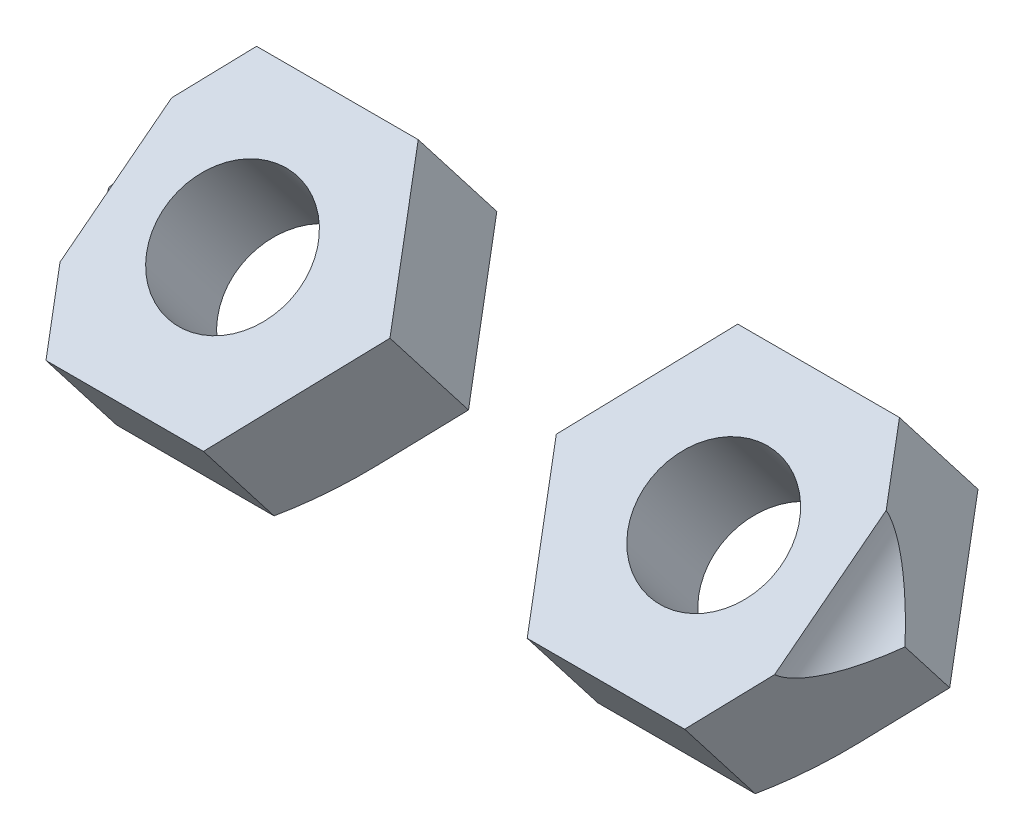
ISO-10303-21;
HEADER;
FILE_DESCRIPTION(('STEP AP214'),'2;1');
FILE_NAME('part.step','',(''),(''),'','','');
FILE_SCHEMA(('AUTOMOTIVE_DESIGN { 1 0 10303 214 1 1 1 1 }'));
ENDSEC;
DATA;
#1=APPLICATION_CONTEXT('core data for automotive mechanical design processes');
#2=APPLICATION_PROTOCOL_DEFINITION('international standard','automotive_design',2000,#1);
#3=PRODUCT_CONTEXT('',#1,'mechanical');
#4=PRODUCT('Part','Part','',(#3));
#5=PRODUCT_RELATED_PRODUCT_CATEGORY('part','',(#4));
#6=PRODUCT_DEFINITION_FORMATION('','',#4);
#7=PRODUCT_DEFINITION_CONTEXT('part definition',#1,'design');
#8=PRODUCT_DEFINITION('design','',#6,#7);
#9=PRODUCT_DEFINITION_SHAPE('','',#8);
#10=(LENGTH_UNIT() NAMED_UNIT(*) SI_UNIT(.MILLI.,.METRE.));
#11=(NAMED_UNIT(*) PLANE_ANGLE_UNIT() SI_UNIT($,.RADIAN.));
#12=(NAMED_UNIT(*) SI_UNIT($,.STERADIAN.) SOLID_ANGLE_UNIT());
#13=UNCERTAINTY_MEASURE_WITH_UNIT(LENGTH_MEASURE(1.E-05),#10,'distance_accuracy_value','');
#14=(GEOMETRIC_REPRESENTATION_CONTEXT(3) GLOBAL_UNCERTAINTY_ASSIGNED_CONTEXT((#13)) GLOBAL_UNIT_ASSIGNED_CONTEXT((#10,
#11,#12)) REPRESENTATION_CONTEXT('',''));
#15=CARTESIAN_POINT('',(0.,0.,0.));
#16=DIRECTION('',(0.,0.,1.));
#17=DIRECTION('',(1.,0.,0.));
#18=AXIS2_PLACEMENT_3D('',#15,#16,#17);
#19=CARTESIAN_POINT('',(35.,10.1270030942691,-11.4457987195592));
#20=DIRECTION('',(0.,-0.612217280034445,0.790689573743847));
#21=DIRECTION('',(0.,-0.790689573743847,-0.612217280034445));
#22=AXIS2_PLACEMENT_3D('',#19,#20,#21);
#23=PLANE('',#22);
#24=DIRECTION('',(0.,0.790689573743847,0.612217280034445));
#25=VECTOR('',#24,1.);
#26=CARTESIAN_POINT('',(9.96017032896648,10.1270030942691,-11.4457987195592));
#27=LINE('',#26,#25);
#28=CARTESIAN_POINT('',(9.96017032896648,10.1270030942691,-11.4457987195592));
#29=VERTEX_POINT('',#28);
#30=CARTESIAN_POINT('',(9.96017032896648,16.4525196842199,-6.54806047928366));
#31=VERTEX_POINT('',#30);
#32=EDGE_CURVE('E185',#29,#31,#27,.T.);
#33=ORIENTED_EDGE('',*,*,#32,.T.);
#34=DIRECTION('',(1.,0.,0.));
#35=VECTOR('',#34,1.);
#36=CARTESIAN_POINT('',(35.,16.4525196842199,-6.54806047928366));
#37=LINE('',#36,#35);
#38=CARTESIAN_POINT('',(20.0398296710335,16.4525196842199,-6.54806047928366));
#39=VERTEX_POINT('',#38);
#40=EDGE_CURVE('E57',#31,#39,#37,.T.);
#41=ORIENTED_EDGE('',*,*,#40,.T.);
#42=DIRECTION('',(0.,-0.790689573743847,-0.612217280034445));
#43=VECTOR('',#42,1.);
#44=CARTESIAN_POINT('',(20.0398296710335,10.1270030942691,-11.4457987195592));
#45=LINE('',#44,#43);
#46=CARTESIAN_POINT('',(20.0398296710335,10.1270030942691,-11.4457987195592));
#47=VERTEX_POINT('',#46);
#48=EDGE_CURVE('E180',#39,#47,#45,.T.);
#49=ORIENTED_EDGE('',*,*,#48,.T.);
#50=DIRECTION('',(-1.,0.,0.));
#51=VECTOR('',#50,1.);
#52=CARTESIAN_POINT('',(35.,10.1270030942691,-11.4457987195592));
#53=LINE('',#52,#51);
#54=EDGE_CURVE('E151',#47,#29,#53,.T.);
#55=ORIENTED_EDGE('',*,*,#54,.T.);
#56=EDGE_LOOP('',(#33,#41,#49,#55));
#57=FACE_BOUND('',#56,.T.);
#58=ADVANCED_FACE('F53',(#57),#23,.F.);
#59=CARTESIAN_POINT('',(35.,0.,1.63340701514295));
#60=DIRECTION('',(0.,0.790689573743847,0.612217280034445));
#61=DIRECTION('',(0.,-0.612217280034445,0.790689573743847));
#62=AXIS2_PLACEMENT_3D('',#59,#60,#61);
#63=PLANE('',#62);
#64=DIRECTION('',(0.5,-0.530195717145641,0.684757257369661));
#65=VECTOR('',#64,1.);
#66=CARTESIAN_POINT('',(5.18504542377636,5.06350154713457,-4.90619585220813));
#67=LINE('',#66,#65);
#68=CARTESIAN_POINT('',(5.18504542377636,5.06350154713457,-4.90619585220813));
#69=VERTEX_POINT('',#68);
#70=CARTESIAN_POINT('',(7.59149303315961,2.51172511507384,-1.61053092219803));
#71=VERTEX_POINT('',#70);
#72=EDGE_CURVE('E156',#69,#71,#67,.T.);
#73=ORIENTED_EDGE('',*,*,#72,.F.);
#74=DIRECTION('',(-0.5,-0.530195717145641,0.68475725736966));
#75=VECTOR('',#74,1.);
#76=CARTESIAN_POINT('',(10.0925227118882,10.2673484274273,-11.6270572290308));
#77=LINE('',#76,#75);
#78=EDGE_CURVE('E13',#29,#69,#77,.T.);
#79=ORIENTED_EDGE('',*,*,#78,.F.);
#80=ORIENTED_EDGE('',*,*,#54,.F.);
#81=DIRECTION('',(-0.5,0.530195717145641,-0.684757257369661));
#82=VECTOR('',#81,1.);
#83=CARTESIAN_POINT('',(24.8149545762236,5.06350154713456,-4.90619585220813));
#84=LINE('',#83,#82);
#85=CARTESIAN_POINT('',(24.8149545762236,5.06350154713456,-4.90619585220813));
#86=VERTEX_POINT('',#85);
#87=EDGE_CURVE('E131',#86,#47,#84,.T.);
#88=ORIENTED_EDGE('',*,*,#87,.F.);
#89=DIRECTION('',(0.500000000000001,0.530195717145641,-0.68475725736966));
#90=VECTOR('',#89,1.);
#91=CARTESIAN_POINT('',(19.9074772881118,-0.140345333158215,1.81466552461457));
#92=LINE('',#91,#90);
#93=CARTESIAN_POINT('',(22.4085069668404,2.51172511507384,-1.61053092219803));
#94=VERTEX_POINT('',#93);
#95=EDGE_CURVE('E139',#94,#86,#92,.T.);
#96=ORIENTED_EDGE('',*,*,#95,.F.);
#97=DIRECTION('',(-1.,0.,0.));
#98=VECTOR('',#97,1.);
#99=CARTESIAN_POINT('',(35.,2.51172511507384,-1.61053092219803));
#100=LINE('',#99,#98);
#101=CARTESIAN_POINT('',(17.8067160009308,2.51172511507386,-1.61053092219802));
#102=VERTEX_POINT('',#101);
#103=EDGE_CURVE('E179',#94,#102,#100,.T.);
#104=ORIENTED_EDGE('',*,*,#103,.T.);
#105=CARTESIAN_POINT('',(15.,5.06350154713459,-4.90619585220811));
#106=DIRECTION('',(0.,-0.790689573743847,-0.612217280034445));
#107=DIRECTION('',(0.,0.612217280034445,-0.790689573743847));
#108=AXIS2_PLACEMENT_3D('',#105,#106,#107);
#109=CIRCLE('',#108,5.025);
#110=CARTESIAN_POINT('',(12.1932839990692,2.51172511507386,-1.61053092219802));
#111=VERTEX_POINT('',#110);
#112=EDGE_CURVE('E204',#111,#102,#109,.T.);
#113=ORIENTED_EDGE('',*,*,#112,.F.);
#114=DIRECTION('',(-1.,0.,0.));
#115=VECTOR('',#114,1.);
#116=CARTESIAN_POINT('',(35.,2.51172511507384,-1.61053092219803));
#117=LINE('',#116,#115);
#118=EDGE_CURVE('E164',#111,#71,#117,.T.);
#119=ORIENTED_EDGE('',*,*,#118,.T.);
#120=EDGE_LOOP('',(#73,#79,#80,#88,#96,#104,#113,#119));
#121=FACE_BOUND('',#120,.T.);
#122=ADVANCED_FACE('F148',(#121),#63,.F.);
#123=CARTESIAN_POINT('',(15.,5.06350154713459,-4.90619585220811));
#124=DIRECTION('',(0.,-0.790689573743847,-0.612217280034445));
#125=DIRECTION('',(0.,0.612217280034445,-0.790689573743847));
#126=AXIS2_PLACEMENT_3D('',#123,#124,#125);
#127=CYLINDRICAL_SURFACE('',#126,4.24999999999999);
#128=CARTESIAN_POINT('',(15.,11.3890181370853,-0.00845761193256963));
#129=DIRECTION('',(0.,-0.790689573743847,-0.612217280034445));
#130=DIRECTION('',(0.,0.612217280034445,-0.790689573743847));
#131=AXIS2_PLACEMENT_3D('',#128,#129,#130);
#132=CIRCLE('',#131,4.24999999999999);
#133=CARTESIAN_POINT('',(15.,13.9909415772317,-3.36888830034391));
#134=VERTEX_POINT('',#133);
#135=EDGE_CURVE('E160',#134,#134,#132,.F.);
#136=ORIENTED_EDGE('',*,*,#135,.T.);
#137=EDGE_LOOP('',(#136));
#138=FACE_BOUND('',#137,.T.);
#139=CARTESIAN_POINT('',(15.,5.67628596678607,-4.43172746018142));
#140=DIRECTION('',(0.,-0.790689573743847,-0.612217280034445));
#141=DIRECTION('',(0.,0.612217280034445,-0.790689573743847));
#142=AXIS2_PLACEMENT_3D('',#139,#140,#141);
#143=CIRCLE('',#142,4.25);
#144=CARTESIAN_POINT('',(15.,8.27820940693246,-7.79215814859276));
#145=VERTEX_POINT('',#144);
#146=EDGE_CURVE('E163',#145,#145,#143,.T.);
#147=ORIENTED_EDGE('',*,*,#146,.T.);
#148=EDGE_LOOP('',(#147));
#149=FACE_BOUND('',#148,.T.);
#150=ADVANCED_FACE('F216',(#138,#149),#127,.F.);
#151=CARTESIAN_POINT('',(15.,5.06350154713459,-4.90619585220811));
#152=DIRECTION('',(0.,-0.790689573743847,-0.612217280034445));
#153=DIRECTION('',(0.,0.612217280034445,-0.790689573743847));
#154=AXIS2_PLACEMENT_3D('',#151,#152,#153);
#155=CONICAL_SURFACE('',#154,5.025,0.78539816339745);
#156=ORIENTED_EDGE('',*,*,#146,.F.);
#157=EDGE_LOOP('',(#156));
#158=FACE_BOUND('',#157,.T.);
#159=ORIENTED_EDGE('',*,*,#112,.T.);
#160=CARTESIAN_POINT('',(17.8067160009308,2.51172511507386,-1.61053092219802));
#161=CARTESIAN_POINT('',(17.7030192372063,2.46898413215126,-1.55531409723204));
#162=CARTESIAN_POINT('',(17.5964133734375,2.42940138175753,-1.5032124944047));
#163=CARTESIAN_POINT('',(17.3783348533039,2.35629021075672,-1.40553697721012));
#164=CARTESIAN_POINT('',(17.2668654100693,2.32275786595345,-1.35995883582597));
#165=CARTESIAN_POINT('',(17.0402097232274,2.26152122008594,-1.27567980442458));
#166=CARTESIAN_POINT('',(16.9250354553005,2.23379996528152,-1.2369589611562));
#167=CARTESIAN_POINT('',(16.6914453460738,2.18381099442509,-1.16640759295901));
#168=CARTESIAN_POINT('',(16.5730288242458,2.16154443318634,-1.13457852725389));
#169=CARTESIAN_POINT('',(16.1962857072843,2.09969064301842,-1.04548109743418));
#170=CARTESIAN_POINT('',(15.9332333865531,2.06952077528535,-1.00089448118005));
#171=CARTESIAN_POINT('',(15.4017352533281,2.03187476962364,-0.945057594814356));
#172=CARTESIAN_POINT('',(15.1332805120876,2.02443995160698,-0.933868023185205));
#173=CARTESIAN_POINT('',(14.5695224707663,2.03236737586458,-0.945723738098697));
#174=CARTESIAN_POINT('',(14.2743189277137,2.05017115204987,-0.972435794387851));
#175=CARTESIAN_POINT('',(13.6939261152242,2.11410281997892,-1.06629483144239));
#176=CARTESIAN_POINT('',(13.4087190013475,2.16017720500566,-1.13336542250657));
#177=CARTESIAN_POINT('',(12.9681181098398,2.25839791243012,-1.27143013522629));
#178=CARTESIAN_POINT('',(12.8065446165969,2.30069456162367,-1.33005782851355));
#179=CARTESIAN_POINT('',(12.4925108388099,2.39712631324149,-1.46053380472282));
#180=CARTESIAN_POINT('',(12.3400523091089,2.45126368599522,-1.53238462261508));
#181=CARTESIAN_POINT('',(12.1932839990692,2.51172511507382,-1.61053092219801));
#182=B_SPLINE_CURVE_WITH_KNOTS('',3,(#160,#161,#162,#163,#164,#165,#166,#167,#168,#169,#170,
#171,#172,#173,#174,#175,#176,#177,#178,#179,#180,#181),.UNSPECIFIED.,.F.,.F.,(4,2,2,2,2,2,2,2,
2,2,4),(0.,0.374868988773201,0.749493962645673,1.12301027766269,1.49660560161683,
2.29860494551191,3.10206102277787,3.98875385753598,4.8737736367147,5.40377668602794,
5.93388144686573),.UNSPECIFIED.);
#183=EDGE_CURVE('E198',#102,#111,#182,.T.);
#184=ORIENTED_EDGE('',*,*,#183,.T.);
#185=EDGE_LOOP('',(#159,#184));
#186=FACE_BOUND('',#185,.T.);
#187=ADVANCED_FACE('F210',(#158,#186),#155,.F.);
#188=CARTESIAN_POINT('',(26.5,16.8135015471346,-6.2685584577647));
#189=DIRECTION('',(0.,0.612217280034445,-0.790689573743847));
#190=DIRECTION('',(0.,0.790689573743847,0.612217280034445));
#191=AXIS2_PLACEMENT_3D('',#188,#189,#190);
#192=CYLINDRICAL_SURFACE('',#191,4.24999999999999);
#193=CARTESIAN_POINT('',(26.5,9.96319226623581,2.57873857544319));
#194=DIRECTION('',(-0.866025403784439,-0.306108640017222,0.395344786871923));
#195=DIRECTION('',(-0.5,0.530195717145641,-0.684757257369661));
#196=AXIS2_PLACEMENT_3D('',#193,#194,#195);
#197=ELLIPSE('',#196,8.49999999999999,4.24999999999999);
#198=CARTESIAN_POINT('',(24.8149545762236,8.66498077414306,-2.11763269205446));
#199=VERTEX_POINT('',#198);
#200=CARTESIAN_POINT('',(22.2745922427991,14.0827965954449,-3.48752070025451));
#201=VERTEX_POINT('',#200);
#202=EDGE_CURVE('E134',#199,#201,#197,.F.);
#203=ORIENTED_EDGE('',*,*,#202,.T.);
#204=DIRECTION('',(0.,0.612217280034445,-0.790689573743847));
#205=VECTOR('',#204,1.);
#206=CARTESIAN_POINT('',(22.2745922427991,16.4525196842199,-6.54806047928366));
#207=LINE('',#206,#205);
#208=CARTESIAN_POINT('',(22.2745922427991,8.69523967872576,3.47060547638936));
#209=VERTEX_POINT('',#208);
#210=EDGE_CURVE('E166',#201,#209,#207,.F.);
#211=ORIENTED_EDGE('',*,*,#210,.T.);
#212=CARTESIAN_POINT('',(26.5,13.5368077337642,-2.0366497562704));
#213=DIRECTION('',(-0.866025403784438,0.306108640017223,-0.395344786871924));
#214=DIRECTION('',(0.500000000000001,0.530195717145641,-0.68475725736966));
#215=AXIS2_PLACEMENT_3D('',#212,#213,#214);
#216=ELLIPSE('',#215,8.49999999999998,4.24999999999999);
#217=EDGE_CURVE('E169',#209,#199,#216,.F.);
#218=ORIENTED_EDGE('',*,*,#217,.T.);
#219=EDGE_LOOP('',(#203,#211,#218));
#220=FACE_BOUND('',#219,.T.);
#221=ADVANCED_FACE('F215',(#220),#192,.F.);
#222=CARTESIAN_POINT('',(35.,12.,5.73607643821531));
#223=DIRECTION('',(-1.,0.,0.));
#224=DIRECTION('',(0.,0.,1.));
#225=AXIS2_PLACEMENT_3D('',#222,#223,#224);
#226=CYLINDRICAL_SURFACE('',#225,12.);
#227=CARTESIAN_POINT('',(7.59149303315961,12.,5.73607643821531));
#228=DIRECTION('',(0.866025403784439,0.306108640017222,-0.395344786871923));
#229=DIRECTION('',(-0.5,0.530195717145641,-0.684757257369661));
#230=AXIS2_PLACEMENT_3D('',#227,#228,#229);
#231=ELLIPSE('',#230,13.856406460551,12.);
#232=CARTESIAN_POINT('',(10.0925227118882,0.499461345763988,2.31005678526184));
#233=VERTEX_POINT('',#232);
#234=EDGE_CURVE('E157',#71,#233,#231,.F.);
#235=ORIENTED_EDGE('',*,*,#234,.F.);
#236=ORIENTED_EDGE('',*,*,#118,.F.);
#237=ORIENTED_EDGE('',*,*,#183,.F.);
#238=ORIENTED_EDGE('',*,*,#103,.F.);
#239=CARTESIAN_POINT('',(22.4085069668404,12.,5.73607643821531));
#240=DIRECTION('',(-0.866025403784438,0.306108640017223,-0.395344786871924));
#241=DIRECTION('',(-0.500000000000001,-0.530195717145641,0.68475725736966));
#242=AXIS2_PLACEMENT_3D('',#239,#240,#241);
#243=ELLIPSE('',#242,13.856406460551,12.);
#244=CARTESIAN_POINT('',(19.9074772881118,0.499461345763988,2.31005678526184));
#245=VERTEX_POINT('',#244);
#246=EDGE_CURVE('E142',#245,#94,#243,.F.);
#247=ORIENTED_EDGE('',*,*,#246,.F.);
#248=DIRECTION('',(-1.,0.,0.));
#249=VECTOR('',#248,1.);
#250=CARTESIAN_POINT('',(35.,0.499461345763988,2.31005678526185));
#251=LINE('',#250,#249);
#252=EDGE_CURVE('E176',#233,#245,#251,.F.);
#253=ORIENTED_EDGE('',*,*,#252,.F.);
#254=EDGE_LOOP('',(#235,#236,#237,#238,#247,#253));
#255=FACE_BOUND('',#254,.T.);
#256=ADVANCED_FACE('F206',(#255),#226,.T.);
#257=CARTESIAN_POINT('',(19.9074772881118,7.76655040428025,7.93683832495902));
#258=DIRECTION('',(-0.866025403784438,0.306108640017223,-0.395344786871924));
#259=DIRECTION('',(-0.415279626546991,0.,0.909693812101078));
#260=AXIS2_PLACEMENT_3D('',#257,#258,#259);
#261=PLANE('',#260);
#262=ORIENTED_EDGE('',*,*,#217,.F.);
#263=DIRECTION('',(-0.500000000000001,-0.530195717145641,0.68475725736966));
#264=VECTOR('',#263,1.);
#265=CARTESIAN_POINT('',(19.9074772881118,6.18517125679256,6.71240376489012));
#266=LINE('',#265,#264);
#267=CARTESIAN_POINT('',(19.9074772881118,6.18517125679256,6.71240376489012));
#268=VERTEX_POINT('',#267);
#269=EDGE_CURVE('E170',#209,#268,#266,.T.);
#270=ORIENTED_EDGE('',*,*,#269,.T.);
#271=DIRECTION('',(0.,-0.790689573743847,-0.612217280034445));
#272=VECTOR('',#271,1.);
#273=CARTESIAN_POINT('',(19.9074772881118,7.76655040428025,7.93683832495902));
#274=LINE('',#273,#272);
#275=EDGE_CURVE('E173',#268,#245,#274,.T.);
#276=ORIENTED_EDGE('',*,*,#275,.T.);
#277=ORIENTED_EDGE('',*,*,#246,.T.);
#278=ORIENTED_EDGE('',*,*,#95,.T.);
#279=DIRECTION('',(0.,-0.790689573743847,-0.612217280034445));
#280=VECTOR('',#279,1.);
#281=CARTESIAN_POINT('',(24.8149545762236,12.970397284573,1.21597694813632));
#282=LINE('',#281,#280);
#283=EDGE_CURVE('E126',#199,#86,#282,.T.);
#284=ORIENTED_EDGE('',*,*,#283,.F.);
#285=EDGE_LOOP('',(#262,#270,#276,#277,#278,#284));
#286=FACE_BOUND('',#285,.T.);
#287=ADVANCED_FACE('F140',(#286),#261,.F.);
#288=CARTESIAN_POINT('',(10.0925227118882,7.76655040428025,7.93683832495902));
#289=DIRECTION('',(0.,0.612217280034445,-0.790689573743847));
#290=DIRECTION('',(0.,0.790689573743847,0.612217280034445));
#291=AXIS2_PLACEMENT_3D('',#288,#289,#290);
#292=PLANE('',#291);
#293=ORIENTED_EDGE('',*,*,#275,.F.);
#294=DIRECTION('',(-1.,0.,0.));
#295=VECTOR('',#294,1.);
#296=CARTESIAN_POINT('',(10.0925227118882,6.18517125679256,6.71240376489012));
#297=LINE('',#296,#295);
#298=CARTESIAN_POINT('',(10.0925227118882,6.18517125679256,6.71240376489013));
#299=VERTEX_POINT('',#298);
#300=EDGE_CURVE('E145',#268,#299,#297,.T.);
#301=ORIENTED_EDGE('',*,*,#300,.T.);
#302=DIRECTION('',(0.,-0.790689573743847,-0.612217280034445));
#303=VECTOR('',#302,1.);
#304=CARTESIAN_POINT('',(10.0925227118882,7.76655040428025,7.93683832495902));
#305=LINE('',#304,#303);
#306=EDGE_CURVE('E175',#299,#233,#305,.T.);
#307=ORIENTED_EDGE('',*,*,#306,.T.);
#308=ORIENTED_EDGE('',*,*,#252,.T.);
#309=EDGE_LOOP('',(#293,#301,#307,#308));
#310=FACE_BOUND('',#309,.T.);
#311=ADVANCED_FACE('F228',(#310),#292,.F.);
#312=CARTESIAN_POINT('',(5.18504542377636,12.970397284573,1.21597694813632));
#313=DIRECTION('',(0.866025403784439,0.306108640017222,-0.395344786871923));
#314=DIRECTION('',(-0.41527962654699,0.,-0.909693812101079));
#315=AXIS2_PLACEMENT_3D('',#312,#313,#314);
#316=PLANE('',#315);
#317=ORIENTED_EDGE('',*,*,#306,.F.);
#318=DIRECTION('',(-0.5,0.530195717145641,-0.684757257369661));
#319=VECTOR('',#318,1.);
#320=CARTESIAN_POINT('',(5.18504542377636,11.3890181370853,-0.0084576119325692));
#321=LINE('',#320,#319);
#322=CARTESIAN_POINT('',(5.18504542377636,11.3890181370853,-0.00845761193256876));
#323=VERTEX_POINT('',#322);
#324=EDGE_CURVE('E88',#299,#323,#321,.T.);
#325=ORIENTED_EDGE('',*,*,#324,.T.);
#326=DIRECTION('',(0.,-0.790689573743847,-0.612217280034445));
#327=VECTOR('',#326,1.);
#328=CARTESIAN_POINT('',(5.18504542377636,12.970397284573,1.21597694813632));
#329=LINE('',#328,#327);
#330=EDGE_CURVE('E158',#323,#69,#329,.T.);
#331=ORIENTED_EDGE('',*,*,#330,.T.);
#332=ORIENTED_EDGE('',*,*,#72,.T.);
#333=ORIENTED_EDGE('',*,*,#234,.T.);
#334=EDGE_LOOP('',(#317,#325,#331,#332,#333));
#335=FACE_BOUND('',#334,.T.);
#336=ADVANCED_FACE('F225',(#335),#316,.F.);
#337=CARTESIAN_POINT('',(24.8149545762236,12.970397284573,1.21597694813632));
#338=DIRECTION('',(-0.866025403784439,-0.306108640017222,0.395344786871923));
#339=DIRECTION('',(0.41527962654699,0.,0.909693812101078));
#340=AXIS2_PLACEMENT_3D('',#337,#338,#339);
#341=PLANE('',#340);
#342=ORIENTED_EDGE('',*,*,#48,.F.);
#343=DIRECTION('',(0.5,-0.530195717145641,0.684757257369661));
#344=VECTOR('',#343,1.);
#345=CARTESIAN_POINT('',(24.8149545762236,11.3890181370853,-0.00845761193256638));
#346=LINE('',#345,#344);
#347=EDGE_CURVE('E72',#39,#201,#346,.T.);
#348=ORIENTED_EDGE('',*,*,#347,.T.);
#349=ORIENTED_EDGE('',*,*,#202,.F.);
#350=ORIENTED_EDGE('',*,*,#283,.T.);
#351=ORIENTED_EDGE('',*,*,#87,.T.);
#352=EDGE_LOOP('',(#342,#348,#349,#350,#351));
#353=FACE_BOUND('',#352,.T.);
#354=ADVANCED_FACE('F129',(#353),#341,.F.);
#355=CARTESIAN_POINT('',(10.0925227118882,18.1742441648658,-5.50488442868637));
#356=DIRECTION('',(0.866025403784439,-0.306108640017223,0.395344786871924));
#357=DIRECTION('',(0.415279626546991,0.,-0.909693812101078));
#358=AXIS2_PLACEMENT_3D('',#355,#356,#357);
#359=PLANE('',#358);
#360=ORIENTED_EDGE('',*,*,#330,.F.);
#361=DIRECTION('',(0.5,0.530195717145641,-0.68475725736966));
#362=VECTOR('',#361,1.);
#363=CARTESIAN_POINT('',(10.0925227118882,16.5928650173781,-6.72931898875526));
#364=LINE('',#363,#362);
#365=EDGE_CURVE('E63',#323,#31,#364,.T.);
#366=ORIENTED_EDGE('',*,*,#365,.T.);
#367=ORIENTED_EDGE('',*,*,#32,.F.);
#368=ORIENTED_EDGE('',*,*,#78,.T.);
#369=EDGE_LOOP('',(#360,#366,#367,#368));
#370=FACE_BOUND('',#369,.T.);
#371=ADVANCED_FACE('F221',(#370),#359,.F.);
#372=CARTESIAN_POINT('',(-35.,23.7792196477454,-16.0106246048554));
#373=DIRECTION('',(0.,-0.790689573743847,-0.612217280034445));
#374=DIRECTION('',(0.,0.612217280034445,-0.790689573743847));
#375=AXIS2_PLACEMENT_3D('',#372,#373,#374);
#376=PLANE('',#375);
#377=ORIENTED_EDGE('',*,*,#40,.F.);
#378=ORIENTED_EDGE('',*,*,#365,.F.);
#379=ORIENTED_EDGE('',*,*,#324,.F.);
#380=ORIENTED_EDGE('',*,*,#300,.F.);
#381=ORIENTED_EDGE('',*,*,#269,.F.);
#382=ORIENTED_EDGE('',*,*,#210,.F.);
#383=ORIENTED_EDGE('',*,*,#347,.F.);
#384=EDGE_LOOP('',(#377,#378,#379,#380,#381,#382,#383));
#385=FACE_BOUND('',#384,.T.);
#386=ORIENTED_EDGE('',*,*,#135,.F.);
#387=EDGE_LOOP('',(#386));
#388=FACE_BOUND('',#387,.T.);
#389=ADVANCED_FACE('F55',(#385,#388),#376,.F.);
#390=CLOSED_SHELL('',(#58,#122,#150,#187,#221,#256,#287,#311,#336,#354,#371,#389));
#391=MANIFOLD_SOLID_BREP('B2',#390);
#392=CARTESIAN_POINT('',(35.,12.,5.73607643821531));
#393=DIRECTION('',(-1.,0.,0.));
#394=DIRECTION('',(0.,0.,1.));
#395=AXIS2_PLACEMENT_3D('',#392,#393,#394);
#396=CYLINDRICAL_SURFACE('',#395,12.);
#397=CARTESIAN_POINT('',(-22.4085069668404,12.,5.73607643821531));
#398=DIRECTION('',(0.866025403784439,0.306108640017223,-0.395344786871923));
#399=DIRECTION('',(-0.5,0.530195717145641,-0.684757257369661));
#400=AXIS2_PLACEMENT_3D('',#397,#398,#399);
#401=ELLIPSE('',#400,13.856406460551,12.);
#402=CARTESIAN_POINT('',(-22.4085069668404,2.51172511507384,-1.61053092219804));
#403=VERTEX_POINT('',#402);
#404=CARTESIAN_POINT('',(-19.9074772881118,0.499461345763988,2.31005678526184));
#405=VERTEX_POINT('',#404);
#406=EDGE_CURVE('E602',#403,#405,#401,.F.);
#407=ORIENTED_EDGE('',*,*,#406,.F.);
#408=DIRECTION('',(-1.,0.,0.));
#409=VECTOR('',#408,1.);
#410=CARTESIAN_POINT('',(35.,2.51172511507384,-1.61053092219803));
#411=LINE('',#410,#409);
#412=CARTESIAN_POINT('',(-17.8067160009308,2.51172511507386,-1.61053092219802));
#413=VERTEX_POINT('',#412);
#414=EDGE_CURVE('E433',#413,#403,#411,.T.);
#415=ORIENTED_EDGE('',*,*,#414,.F.);
#416=CARTESIAN_POINT('',(-12.1932839990692,2.51172511507386,-1.61053092219802));
#417=CARTESIAN_POINT('',(-12.2969807627937,2.46898413215126,-1.55531409723204));
#418=CARTESIAN_POINT('',(-12.4035866265625,2.42940138175754,-1.5032124944047));
#419=CARTESIAN_POINT('',(-12.6216651466961,2.35629021075672,-1.40553697721012));
#420=CARTESIAN_POINT('',(-12.7331345899307,2.32275786595345,-1.35995883582597));
#421=CARTESIAN_POINT('',(-12.9597902767726,2.26152122008594,-1.27567980442458));
#422=CARTESIAN_POINT('',(-13.0749645446995,2.23379996528152,-1.2369589611562));
#423=CARTESIAN_POINT('',(-13.3085546539262,2.18381099442509,-1.16640759295901));
#424=CARTESIAN_POINT('',(-13.4269711757542,2.16154443318634,-1.13457852725389));
#425=CARTESIAN_POINT('',(-13.8037142927157,2.09969064301842,-1.04548109743418));
#426=CARTESIAN_POINT('',(-14.0667666134469,2.06952077528535,-1.00089448118005));
#427=CARTESIAN_POINT('',(-14.5982647466719,2.03187476962364,-0.945057594814356));
#428=CARTESIAN_POINT('',(-14.8667194879124,2.02443995160699,-0.933868023185204));
#429=CARTESIAN_POINT('',(-15.4304775292337,2.03236737586458,-0.945723738098696));
#430=CARTESIAN_POINT('',(-15.7256810722863,2.05017115204987,-0.972435794387851));
#431=CARTESIAN_POINT('',(-16.3060738847758,2.11410281997892,-1.06629483144239));
#432=CARTESIAN_POINT('',(-16.5912809986525,2.16017720500566,-1.13336542250657));
#433=CARTESIAN_POINT('',(-17.0318818901602,2.25839791243012,-1.27143013522629));
#434=CARTESIAN_POINT('',(-17.1934553834031,2.30069456162366,-1.33005782851355));
#435=CARTESIAN_POINT('',(-17.5074891611901,2.39712631324149,-1.46053380472281));
#436=CARTESIAN_POINT('',(-17.6599476908911,2.45126368599521,-1.53238462261507));
#437=CARTESIAN_POINT('',(-17.8067160009308,2.51172511507382,-1.61053092219801));
#438=B_SPLINE_CURVE_WITH_KNOTS('',3,(#416,#417,#418,#419,#420,#421,#422,#423,#424,#425,#426,
#427,#428,#429,#430,#431,#432,#433,#434,#435,#436,#437),.UNSPECIFIED.,.F.,.F.,(4,2,2,2,2,2,2,2,
2,2,4),(0.,0.374868988773203,0.749493962645675,1.1230102776627,1.49660560161683,2.2986049455119,
3.10206102277787,3.98875385753598,4.8737736367147,5.40377668602793,5.93388144686573),.UNSPECIFIED.);
#439=CARTESIAN_POINT('',(-12.1932839990692,2.51172511507386,-1.61053092219802));
#440=VERTEX_POINT('',#439);
#441=EDGE_CURVE('E438',#440,#413,#438,.T.);
#442=ORIENTED_EDGE('',*,*,#441,.F.);
#443=DIRECTION('',(-1.,0.,0.));
#444=VECTOR('',#443,1.);
#445=CARTESIAN_POINT('',(35.,2.51172511507384,-1.61053092219803));
#446=LINE('',#445,#444);
#447=CARTESIAN_POINT('',(-7.5914930331596,2.51172511507384,-1.61053092219804));
#448=VERTEX_POINT('',#447);
#449=EDGE_CURVE('E436',#448,#440,#446,.T.);
#450=ORIENTED_EDGE('',*,*,#449,.F.);
#451=CARTESIAN_POINT('',(-7.5914930331596,12.,5.73607643821531));
#452=DIRECTION('',(-0.866025403784439,0.306108640017223,-0.395344786871923));
#453=DIRECTION('',(-0.5,-0.530195717145641,0.684757257369661));
#454=AXIS2_PLACEMENT_3D('',#451,#452,#453);
#455=ELLIPSE('',#454,13.856406460551,12.);
#456=CARTESIAN_POINT('',(-10.0925227118882,0.499461345763991,2.31005678526185));
#457=VERTEX_POINT('',#456);
#458=EDGE_CURVE('E444',#457,#448,#455,.F.);
#459=ORIENTED_EDGE('',*,*,#458,.F.);
#460=DIRECTION('',(-1.,0.,0.));
#461=VECTOR('',#460,1.);
#462=CARTESIAN_POINT('',(35.,0.499461345763988,2.31005678526185));
#463=LINE('',#462,#461);
#464=EDGE_CURVE('E600',#405,#457,#463,.F.);
#465=ORIENTED_EDGE('',*,*,#464,.F.);
#466=EDGE_LOOP('',(#407,#415,#442,#450,#459,#465));
#467=FACE_BOUND('',#466,.T.);
#468=ADVANCED_FACE('F332',(#467),#396,.T.);
#469=CARTESIAN_POINT('',(35.,0.,1.63340701514295));
#470=DIRECTION('',(0.,0.790689573743847,0.612217280034445));
#471=DIRECTION('',(0.,-0.612217280034445,0.790689573743847));
#472=AXIS2_PLACEMENT_3D('',#469,#470,#471);
#473=PLANE('',#472);
#474=DIRECTION('',(0.5,-0.530195717145641,0.684757257369661));
#475=VECTOR('',#474,1.);
#476=CARTESIAN_POINT('',(-24.8149545762236,5.06350154713457,-4.90619585220813));
#477=LINE('',#476,#475);
#478=CARTESIAN_POINT('',(-24.8149545762236,5.06350154713457,-4.90619585220813));
#479=VERTEX_POINT('',#478);
#480=EDGE_CURVE('E472',#479,#403,#477,.T.);
#481=ORIENTED_EDGE('',*,*,#480,.F.);
#482=DIRECTION('',(-0.5,-0.530195717145641,0.684757257369661));
#483=VECTOR('',#482,1.);
#484=CARTESIAN_POINT('',(-19.9074772881118,10.2673484274273,-11.6270572290308));
#485=LINE('',#484,#483);
#486=CARTESIAN_POINT('',(-20.0398296710335,10.1270030942691,-11.4457987195592));
#487=VERTEX_POINT('',#486);
#488=EDGE_CURVE('E473',#487,#479,#485,.T.);
#489=ORIENTED_EDGE('',*,*,#488,.F.);
#490=DIRECTION('',(-1.,0.,0.));
#491=VECTOR('',#490,1.);
#492=CARTESIAN_POINT('',(35.,10.1270030942691,-11.4457987195592));
#493=LINE('',#492,#491);
#494=CARTESIAN_POINT('',(-9.96017032896648,10.1270030942691,-11.4457987195592));
#495=VERTEX_POINT('',#494);
#496=EDGE_CURVE('E431',#495,#487,#493,.T.);
#497=ORIENTED_EDGE('',*,*,#496,.F.);
#498=DIRECTION('',(-0.5,0.530195717145641,-0.684757257369661));
#499=VECTOR('',#498,1.);
#500=CARTESIAN_POINT('',(-5.18504542377636,5.06350154713456,-4.90619585220813));
#501=LINE('',#500,#499);
#502=CARTESIAN_POINT('',(-5.18504542377636,5.06350154713456,-4.90619585220813));
#503=VERTEX_POINT('',#502);
#504=EDGE_CURVE('E418',#503,#495,#501,.T.);
#505=ORIENTED_EDGE('',*,*,#504,.F.);
#506=DIRECTION('',(0.5,0.530195717145641,-0.684757257369661));
#507=VECTOR('',#506,1.);
#508=CARTESIAN_POINT('',(-10.0925227118882,-0.140345333158215,1.81466552461457));
#509=LINE('',#508,#507);
#510=EDGE_CURVE('E480',#448,#503,#509,.T.);
#511=ORIENTED_EDGE('',*,*,#510,.F.);
#512=ORIENTED_EDGE('',*,*,#449,.T.);
#513=CARTESIAN_POINT('',(-15.,5.06350154713459,-4.90619585220811));
#514=DIRECTION('',(0.,-0.790689573743847,-0.612217280034445));
#515=DIRECTION('',(0.,0.612217280034445,-0.790689573743847));
#516=AXIS2_PLACEMENT_3D('',#513,#514,#515);
#517=CIRCLE('',#516,5.025);
#518=EDGE_CURVE('E420',#413,#440,#517,.T.);
#519=ORIENTED_EDGE('',*,*,#518,.F.);
#520=ORIENTED_EDGE('',*,*,#414,.T.);
#521=EDGE_LOOP('',(#481,#489,#497,#505,#511,#512,#519,#520));
#522=FACE_BOUND('',#521,.T.);
#523=ADVANCED_FACE('F459',(#522),#473,.F.);
#524=CARTESIAN_POINT('',(-19.9074772881118,18.1742441648658,-5.50488442868637));
#525=DIRECTION('',(0.866025403784438,-0.306108640017223,0.395344786871924));
#526=DIRECTION('',(0.415279626546991,0.,-0.909693812101078));
#527=AXIS2_PLACEMENT_3D('',#524,#525,#526);
#528=PLANE('',#527);
#529=CARTESIAN_POINT('',(-26.5,9.96319226623582,2.57873857544319));
#530=DIRECTION('',(0.866025403784438,-0.306108640017223,0.395344786871924));
#531=DIRECTION('',(0.5,0.530195717145641,-0.684757257369661));
#532=AXIS2_PLACEMENT_3D('',#529,#530,#531);
#533=ELLIPSE('',#532,8.49999999999998,4.24999999999999);
#534=CARTESIAN_POINT('',(-22.2745922427991,14.0827965954449,-3.4875207002545));
#535=VERTEX_POINT('',#534);
#536=CARTESIAN_POINT('',(-24.8149545762236,8.66498077414306,-2.11763269205446));
#537=VERTEX_POINT('',#536);
#538=EDGE_CURVE('E340',#535,#537,#533,.F.);
#539=ORIENTED_EDGE('',*,*,#538,.F.);
#540=DIRECTION('',(0.5,0.530195717145641,-0.68475725736966));
#541=VECTOR('',#540,1.);
#542=CARTESIAN_POINT('',(-19.9074772881118,16.5928650173781,-6.72931898875526));
#543=LINE('',#542,#541);
#544=CARTESIAN_POINT('',(-20.0398296710335,16.4525196842199,-6.54806047928366));
#545=VERTEX_POINT('',#544);
#546=EDGE_CURVE('E414',#535,#545,#543,.T.);
#547=ORIENTED_EDGE('',*,*,#546,.T.);
#548=DIRECTION('',(0.,0.790689573743847,0.612217280034445));
#549=VECTOR('',#548,1.);
#550=CARTESIAN_POINT('',(-20.0398296710335,10.1270030942691,-11.4457987195592));
#551=LINE('',#550,#549);
#552=EDGE_CURVE('E413',#487,#545,#551,.T.);
#553=ORIENTED_EDGE('',*,*,#552,.F.);
#554=ORIENTED_EDGE('',*,*,#488,.T.);
#555=DIRECTION('',(0.,-0.790689573743847,-0.612217280034445));
#556=VECTOR('',#555,1.);
#557=CARTESIAN_POINT('',(-24.8149545762236,12.970397284573,1.21597694813632));
#558=LINE('',#557,#556);
#559=EDGE_CURVE('E494',#537,#479,#558,.T.);
#560=ORIENTED_EDGE('',*,*,#559,.F.);
#561=EDGE_LOOP('',(#539,#547,#553,#554,#560));
#562=FACE_BOUND('',#561,.T.);
#563=ADVANCED_FACE('F461',(#562),#528,.F.);
#564=CARTESIAN_POINT('',(-24.8149545762236,12.970397284573,1.21597694813632));
#565=DIRECTION('',(0.866025403784439,0.306108640017223,-0.395344786871923));
#566=DIRECTION('',(-0.415279626546991,0.,-0.909693812101078));
#567=AXIS2_PLACEMENT_3D('',#564,#565,#566);
#568=PLANE('',#567);
#569=DIRECTION('',(0.,-0.790689573743847,-0.612217280034445));
#570=VECTOR('',#569,1.);
#571=CARTESIAN_POINT('',(-19.9074772881118,7.76655040428025,7.93683832495902));
#572=LINE('',#571,#570);
#573=CARTESIAN_POINT('',(-19.9074772881118,6.18517125679256,6.71240376489012));
#574=VERTEX_POINT('',#573);
#575=EDGE_CURVE('E492',#574,#405,#572,.T.);
#576=ORIENTED_EDGE('',*,*,#575,.F.);
#577=DIRECTION('',(-0.5,0.530195717145641,-0.684757257369661));
#578=VECTOR('',#577,1.);
#579=CARTESIAN_POINT('',(-24.8149545762236,11.3890181370853,-0.00845761193256898));
#580=LINE('',#579,#578);
#581=CARTESIAN_POINT('',(-22.2745922427991,8.69523967872576,3.47060547638937));
#582=VERTEX_POINT('',#581);
#583=EDGE_CURVE('E504',#574,#582,#580,.T.);
#584=ORIENTED_EDGE('',*,*,#583,.T.);
#585=CARTESIAN_POINT('',(-26.5,13.5368077337642,-2.03664975627039));
#586=DIRECTION('',(0.866025403784439,0.306108640017223,-0.395344786871923));
#587=DIRECTION('',(-0.5,0.530195717145641,-0.684757257369661));
#588=AXIS2_PLACEMENT_3D('',#585,#586,#587);
#589=ELLIPSE('',#588,8.49999999999998,4.24999999999999);
#590=EDGE_CURVE('E425',#537,#582,#589,.F.);
#591=ORIENTED_EDGE('',*,*,#590,.F.);
#592=ORIENTED_EDGE('',*,*,#559,.T.);
#593=ORIENTED_EDGE('',*,*,#480,.T.);
#594=ORIENTED_EDGE('',*,*,#406,.T.);
#595=EDGE_LOOP('',(#576,#584,#591,#592,#593,#594));
#596=FACE_BOUND('',#595,.T.);
#597=ADVANCED_FACE('F467',(#596),#568,.F.);
#598=CARTESIAN_POINT('',(-19.9074772881118,7.76655040428025,7.93683832495902));
#599=DIRECTION('',(0.,0.612217280034445,-0.790689573743847));
#600=DIRECTION('',(0.,0.790689573743847,0.612217280034445));
#601=AXIS2_PLACEMENT_3D('',#598,#599,#600);
#602=PLANE('',#601);
#603=DIRECTION('',(0.,-0.790689573743847,-0.612217280034445));
#604=VECTOR('',#603,1.);
#605=CARTESIAN_POINT('',(-10.0925227118882,7.76655040428025,7.93683832495902));
#606=LINE('',#605,#604);
#607=CARTESIAN_POINT('',(-10.0925227118882,6.18517125679256,6.71240376489012));
#608=VERTEX_POINT('',#607);
#609=EDGE_CURVE('E353',#608,#457,#606,.T.);
#610=ORIENTED_EDGE('',*,*,#609,.F.);
#611=DIRECTION('',(-1.,0.,0.));
#612=VECTOR('',#611,1.);
#613=CARTESIAN_POINT('',(-19.9074772881118,6.18517125679256,6.71240376489012));
#614=LINE('',#613,#612);
#615=EDGE_CURVE('E505',#608,#574,#614,.T.);
#616=ORIENTED_EDGE('',*,*,#615,.T.);
#617=ORIENTED_EDGE('',*,*,#575,.T.);
#618=ORIENTED_EDGE('',*,*,#464,.T.);
#619=EDGE_LOOP('',(#610,#616,#617,#618));
#620=FACE_BOUND('',#619,.T.);
#621=ADVANCED_FACE('F523',(#620),#602,.F.);
#622=CARTESIAN_POINT('',(-5.18504542377636,12.970397284573,1.21597694813632));
#623=DIRECTION('',(-0.866025403784439,-0.306108640017223,0.395344786871923));
#624=DIRECTION('',(0.415279626546991,0.,0.909693812101078));
#625=AXIS2_PLACEMENT_3D('',#622,#623,#624);
#626=PLANE('',#625);
#627=DIRECTION('',(0.,-0.790689573743847,-0.612217280034445));
#628=VECTOR('',#627,1.);
#629=CARTESIAN_POINT('',(-9.96017032896648,10.1270030942691,-11.4457987195592));
#630=LINE('',#629,#628);
#631=CARTESIAN_POINT('',(-9.96017032896648,16.4525196842199,-6.54806047928366));
#632=VERTEX_POINT('',#631);
#633=EDGE_CURVE('E411',#632,#495,#630,.T.);
#634=ORIENTED_EDGE('',*,*,#633,.F.);
#635=DIRECTION('',(0.5,-0.530195717145641,0.684757257369661));
#636=VECTOR('',#635,1.);
#637=CARTESIAN_POINT('',(-5.18504542377636,11.3890181370853,-0.00845761193256638));
#638=LINE('',#637,#636);
#639=CARTESIAN_POINT('',(-5.18504542377636,11.3890181370853,-0.00845761193256654));
#640=VERTEX_POINT('',#639);
#641=EDGE_CURVE('E51',#632,#640,#638,.T.);
#642=ORIENTED_EDGE('',*,*,#641,.T.);
#643=DIRECTION('',(0.,-0.790689573743847,-0.612217280034445));
#644=VECTOR('',#643,1.);
#645=CARTESIAN_POINT('',(-5.18504542377636,12.970397284573,1.21597694813632));
#646=LINE('',#645,#644);
#647=EDGE_CURVE('E489',#640,#503,#646,.T.);
#648=ORIENTED_EDGE('',*,*,#647,.T.);
#649=ORIENTED_EDGE('',*,*,#504,.T.);
#650=EDGE_LOOP('',(#634,#642,#648,#649));
#651=FACE_BOUND('',#650,.T.);
#652=ADVANCED_FACE('F416',(#651),#626,.F.);
#653=CARTESIAN_POINT('',(-10.0925227118882,7.76655040428025,7.93683832495902));
#654=DIRECTION('',(-0.866025403784439,0.306108640017223,-0.395344786871923));
#655=DIRECTION('',(-0.415279626546991,0.,0.909693812101078));
#656=AXIS2_PLACEMENT_3D('',#653,#654,#655);
#657=PLANE('',#656);
#658=ORIENTED_EDGE('',*,*,#647,.F.);
#659=DIRECTION('',(-0.5,-0.530195717145641,0.684757257369661));
#660=VECTOR('',#659,1.);
#661=CARTESIAN_POINT('',(-10.0925227118882,6.18517125679256,6.71240376489012));
#662=LINE('',#661,#660);
#663=EDGE_CURVE('E347',#640,#608,#662,.T.);
#664=ORIENTED_EDGE('',*,*,#663,.T.);
#665=ORIENTED_EDGE('',*,*,#609,.T.);
#666=ORIENTED_EDGE('',*,*,#458,.T.);
#667=ORIENTED_EDGE('',*,*,#510,.T.);
#668=EDGE_LOOP('',(#658,#664,#665,#666,#667));
#669=FACE_BOUND('',#668,.T.);
#670=ADVANCED_FACE('F522',(#669),#657,.F.);
#671=CARTESIAN_POINT('',(-26.5,16.8135015471346,-6.26855845776469));
#672=DIRECTION('',(0.,0.612217280034445,-0.790689573743847));
#673=DIRECTION('',(0.,0.790689573743847,0.612217280034445));
#674=AXIS2_PLACEMENT_3D('',#671,#672,#673);
#675=CYLINDRICAL_SURFACE('',#674,4.24999999999999);
#676=ORIENTED_EDGE('',*,*,#590,.T.);
#677=DIRECTION('',(0.,0.612217280034445,-0.790689573743847));
#678=VECTOR('',#677,1.);
#679=CARTESIAN_POINT('',(-22.2745922427991,16.4525196842199,-6.54806047928366));
#680=LINE('',#679,#678);
#681=EDGE_CURVE('E499',#582,#535,#680,.T.);
#682=ORIENTED_EDGE('',*,*,#681,.T.);
#683=ORIENTED_EDGE('',*,*,#538,.T.);
#684=EDGE_LOOP('',(#676,#682,#683));
#685=FACE_BOUND('',#684,.T.);
#686=ADVANCED_FACE('F453',(#685),#675,.F.);
#687=CARTESIAN_POINT('',(35.,10.1270030942691,-11.4457987195592));
#688=DIRECTION('',(0.,-0.612217280034445,0.790689573743847));
#689=DIRECTION('',(0.,-0.790689573743847,-0.612217280034445));
#690=AXIS2_PLACEMENT_3D('',#687,#688,#689);
#691=PLANE('',#690);
#692=ORIENTED_EDGE('',*,*,#552,.T.);
#693=DIRECTION('',(1.,0.,0.));
#694=VECTOR('',#693,1.);
#695=CARTESIAN_POINT('',(35.,16.4525196842199,-6.54806047928366));
#696=LINE('',#695,#694);
#697=EDGE_CURVE('E402',#545,#632,#696,.T.);
#698=ORIENTED_EDGE('',*,*,#697,.T.);
#699=ORIENTED_EDGE('',*,*,#633,.T.);
#700=ORIENTED_EDGE('',*,*,#496,.T.);
#701=EDGE_LOOP('',(#692,#698,#699,#700));
#702=FACE_BOUND('',#701,.T.);
#703=ADVANCED_FACE('F409',(#702),#691,.F.);
#704=CARTESIAN_POINT('',(-15.,5.06350154713459,-4.90619585220811));
#705=DIRECTION('',(0.,-0.790689573743847,-0.612217280034445));
#706=DIRECTION('',(0.,0.612217280034445,-0.790689573743847));
#707=AXIS2_PLACEMENT_3D('',#704,#705,#706);
#708=CONICAL_SURFACE('',#707,5.025,0.78539816339745);
#709=CARTESIAN_POINT('',(-15.,5.67628596678607,-4.43172746018142));
#710=DIRECTION('',(0.,-0.790689573743847,-0.612217280034445));
#711=DIRECTION('',(0.,0.612217280034445,-0.790689573743847));
#712=AXIS2_PLACEMENT_3D('',#709,#710,#711);
#713=CIRCLE('',#712,4.25);
#714=CARTESIAN_POINT('',(-15.,8.27820940693246,-7.79215814859276));
#715=VERTEX_POINT('',#714);
#716=EDGE_CURVE('E423',#715,#715,#713,.T.);
#717=ORIENTED_EDGE('',*,*,#716,.F.);
#718=EDGE_LOOP('',(#717));
#719=FACE_BOUND('',#718,.T.);
#720=ORIENTED_EDGE('',*,*,#518,.T.);
#721=ORIENTED_EDGE('',*,*,#441,.T.);
#722=EDGE_LOOP('',(#720,#721));
#723=FACE_BOUND('',#722,.T.);
#724=ADVANCED_FACE('F446',(#719,#723),#708,.F.);
#725=CARTESIAN_POINT('',(-15.,5.06350154713459,-4.90619585220811));
#726=DIRECTION('',(0.,-0.790689573743847,-0.612217280034445));
#727=DIRECTION('',(0.,0.612217280034445,-0.790689573743847));
#728=AXIS2_PLACEMENT_3D('',#725,#726,#727);
#729=CYLINDRICAL_SURFACE('',#728,4.24999999999999);
#730=CARTESIAN_POINT('',(-15.,11.3890181370853,-0.00845761193256963));
#731=DIRECTION('',(0.,-0.790689573743847,-0.612217280034445));
#732=DIRECTION('',(0.,0.612217280034445,-0.790689573743847));
#733=AXIS2_PLACEMENT_3D('',#730,#731,#732);
#734=CIRCLE('',#733,4.24999999999999);
#735=CARTESIAN_POINT('',(-15.,13.9909415772317,-3.36888830034391));
#736=VERTEX_POINT('',#735);
#737=EDGE_CURVE('E484',#736,#736,#734,.F.);
#738=ORIENTED_EDGE('',*,*,#737,.T.);
#739=EDGE_LOOP('',(#738));
#740=FACE_BOUND('',#739,.T.);
#741=ORIENTED_EDGE('',*,*,#716,.T.);
#742=EDGE_LOOP('',(#741));
#743=FACE_BOUND('',#742,.T.);
#744=ADVANCED_FACE('F451',(#740,#743),#729,.F.);
#745=CARTESIAN_POINT('',(-35.,23.7792196477454,-16.0106246048554));
#746=DIRECTION('',(0.,-0.790689573743847,-0.612217280034445));
#747=DIRECTION('',(0.,0.612217280034445,-0.790689573743847));
#748=AXIS2_PLACEMENT_3D('',#745,#746,#747);
#749=PLANE('',#748);
#750=ORIENTED_EDGE('',*,*,#615,.F.);
#751=ORIENTED_EDGE('',*,*,#663,.F.);
#752=ORIENTED_EDGE('',*,*,#641,.F.);
#753=ORIENTED_EDGE('',*,*,#697,.F.);
#754=ORIENTED_EDGE('',*,*,#546,.F.);
#755=ORIENTED_EDGE('',*,*,#681,.F.);
#756=ORIENTED_EDGE('',*,*,#583,.F.);
#757=EDGE_LOOP('',(#750,#751,#752,#753,#754,#755,#756));
#758=FACE_BOUND('',#757,.T.);
#759=ORIENTED_EDGE('',*,*,#737,.F.);
#760=EDGE_LOOP('',(#759));
#761=FACE_BOUND('',#760,.T.);
#762=ADVANCED_FACE('F400',(#758,#761),#749,.F.);
#763=CLOSED_SHELL('',(#468,#523,#563,#597,#621,#652,#670,#686,#703,#724,#744,#762));
#764=MANIFOLD_SOLID_BREP('B7',#763);
#765=ADVANCED_BREP_SHAPE_REPRESENTATION('',(#18,#391,#764),#14);
#766=SHAPE_DEFINITION_REPRESENTATION(#9,#765);
ENDSEC;
END-ISO-10303-21;
